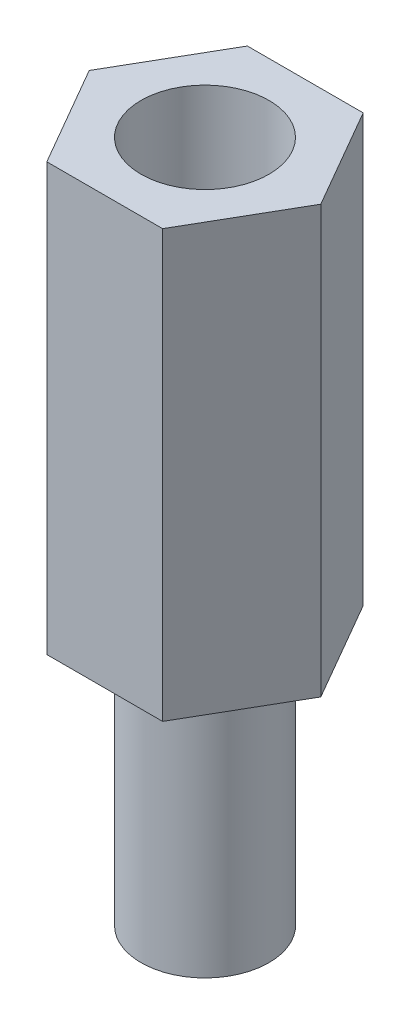
ISO-10303-21;
HEADER;
FILE_DESCRIPTION(('STEP AP214'),'2;1');
FILE_NAME('part.step','',(''),(''),'','','');
FILE_SCHEMA(('AUTOMOTIVE_DESIGN { 1 0 10303 214 1 1 1 1 }'));
ENDSEC;
DATA;
#1=APPLICATION_CONTEXT('core data for automotive mechanical design processes');
#2=APPLICATION_PROTOCOL_DEFINITION('international standard','automotive_design',2000,#1);
#3=PRODUCT_CONTEXT('',#1,'mechanical');
#4=PRODUCT('Part','Part','',(#3));
#5=PRODUCT_RELATED_PRODUCT_CATEGORY('part','',(#4));
#6=PRODUCT_DEFINITION_FORMATION('','',#4);
#7=PRODUCT_DEFINITION_CONTEXT('part definition',#1,'design');
#8=PRODUCT_DEFINITION('design','',#6,#7);
#9=PRODUCT_DEFINITION_SHAPE('','',#8);
#10=(LENGTH_UNIT() NAMED_UNIT(*) SI_UNIT(.MILLI.,.METRE.));
#11=(NAMED_UNIT(*) PLANE_ANGLE_UNIT() SI_UNIT($,.RADIAN.));
#12=(NAMED_UNIT(*) SI_UNIT($,.STERADIAN.) SOLID_ANGLE_UNIT());
#13=UNCERTAINTY_MEASURE_WITH_UNIT(LENGTH_MEASURE(1.E-05),#10,'distance_accuracy_value','');
#14=(GEOMETRIC_REPRESENTATION_CONTEXT(3) GLOBAL_UNCERTAINTY_ASSIGNED_CONTEXT((#13)) GLOBAL_UNIT_ASSIGNED_CONTEXT((#10,
#11,#12)) REPRESENTATION_CONTEXT('',''));
#15=CARTESIAN_POINT('',(0.,0.,0.));
#16=DIRECTION('',(0.,0.,1.));
#17=DIRECTION('',(1.,0.,0.));
#18=AXIS2_PLACEMENT_3D('',#15,#16,#17);
#19=CARTESIAN_POINT('',(0.,-6.,0.));
#20=DIRECTION('',(0.,1.,0.));
#21=DIRECTION('',(0.,0.,1.));
#22=AXIS2_PLACEMENT_3D('',#19,#20,#21);
#23=CYLINDRICAL_SURFACE('',#22,1.5);
#24=CARTESIAN_POINT('',(0.,-6.,0.));
#25=DIRECTION('',(0.,-1.,0.));
#26=DIRECTION('',(0.,0.,-1.));
#27=AXIS2_PLACEMENT_3D('',#24,#25,#26);
#28=CIRCLE('',#27,1.5);
#29=CARTESIAN_POINT('',(0.,-6.,-1.5));
#30=VERTEX_POINT('',#29);
#31=EDGE_CURVE('E11',#30,#30,#28,.T.);
#32=ORIENTED_EDGE('',*,*,#31,.F.);
#33=EDGE_LOOP('',(#32));
#34=FACE_BOUND('',#33,.T.);
#35=CARTESIAN_POINT('',(0.,0.,0.));
#36=DIRECTION('',(0.,-1.,0.));
#37=DIRECTION('',(0.,0.,-1.));
#38=AXIS2_PLACEMENT_3D('',#35,#36,#37);
#39=CIRCLE('',#38,1.5);
#40=CARTESIAN_POINT('',(0.,0.,-1.5));
#41=VERTEX_POINT('',#40);
#42=EDGE_CURVE('E45',#41,#41,#39,.T.);
#43=ORIENTED_EDGE('',*,*,#42,.T.);
#44=EDGE_LOOP('',(#43));
#45=FACE_BOUND('',#44,.T.);
#46=ADVANCED_FACE('F42',(#34,#45),#23,.T.);
#47=CARTESIAN_POINT('',(0.,-6.,0.));
#48=DIRECTION('',(0.,-1.,0.));
#49=DIRECTION('',(0.,0.,-1.));
#50=AXIS2_PLACEMENT_3D('',#47,#48,#49);
#51=PLANE('',#50);
#52=ORIENTED_EDGE('',*,*,#31,.T.);
#53=EDGE_LOOP('',(#52));
#54=FACE_BOUND('',#53,.T.);
#55=ADVANCED_FACE('F57',(#54),#51,.T.);
#56=CARTESIAN_POINT('',(0.,0.,0.));
#57=DIRECTION('',(0.,-1.,0.));
#58=DIRECTION('',(0.,0.,-1.));
#59=AXIS2_PLACEMENT_3D('',#56,#57,#58);
#60=PLANE('',#59);
#61=ORIENTED_EDGE('',*,*,#42,.F.);
#62=EDGE_LOOP('',(#61));
#63=FACE_BOUND('',#62,.T.);
#64=ADVANCED_FACE('F55',(#63),#60,.F.);
#65=CLOSED_SHELL('',(#46,#55,#64));
#66=MANIFOLD_SOLID_BREP('B2',#65);
#67=CARTESIAN_POINT('',(0.,10.,0.));
#68=DIRECTION('',(0.,1.,0.));
#69=DIRECTION('',(0.,0.,1.));
#70=AXIS2_PLACEMENT_3D('',#67,#68,#69);
#71=PLANE('',#70);
#72=DIRECTION('',(0.5,0.,-0.866025403784438));
#73=VECTOR('',#72,1.);
#74=CARTESIAN_POINT('',(1.35677313259562,10.,2.35));
#75=LINE('',#74,#73);
#76=CARTESIAN_POINT('',(1.35677313259562,10.,2.35));
#77=VERTEX_POINT('',#76);
#78=CARTESIAN_POINT('',(2.71354626519124,10.,0.));
#79=VERTEX_POINT('',#78);
#80=EDGE_CURVE('E178',#77,#79,#75,.T.);
#81=ORIENTED_EDGE('',*,*,#80,.T.);
#82=DIRECTION('',(-0.5,0.,-0.866025403784438));
#83=VECTOR('',#82,1.);
#84=CARTESIAN_POINT('',(2.71354626519124,10.,0.));
#85=LINE('',#84,#83);
#86=CARTESIAN_POINT('',(1.35677313259562,10.,-2.35));
#87=VERTEX_POINT('',#86);
#88=EDGE_CURVE('E136',#79,#87,#85,.T.);
#89=ORIENTED_EDGE('',*,*,#88,.T.);
#90=DIRECTION('',(-1.,0.,0.));
#91=VECTOR('',#90,1.);
#92=CARTESIAN_POINT('',(1.35677313259562,10.,-2.35));
#93=LINE('',#92,#91);
#94=CARTESIAN_POINT('',(-1.35677313259562,10.,-2.35));
#95=VERTEX_POINT('',#94);
#96=EDGE_CURVE('E149',#87,#95,#93,.T.);
#97=ORIENTED_EDGE('',*,*,#96,.T.);
#98=DIRECTION('',(-0.5,0.,0.866025403784439));
#99=VECTOR('',#98,1.);
#100=CARTESIAN_POINT('',(-1.35677313259562,10.,-2.35));
#101=LINE('',#100,#99);
#102=CARTESIAN_POINT('',(-2.71354626519124,10.,0.));
#103=VERTEX_POINT('',#102);
#104=EDGE_CURVE('E143',#95,#103,#101,.T.);
#105=ORIENTED_EDGE('',*,*,#104,.T.);
#106=DIRECTION('',(0.5,0.,0.866025403784438));
#107=VECTOR('',#106,1.);
#108=CARTESIAN_POINT('',(-2.71354626519124,10.,0.));
#109=LINE('',#108,#107);
#110=CARTESIAN_POINT('',(-1.35677313259562,10.,2.35));
#111=VERTEX_POINT('',#110);
#112=EDGE_CURVE('E147',#103,#111,#109,.T.);
#113=ORIENTED_EDGE('',*,*,#112,.T.);
#114=DIRECTION('',(1.,0.,0.));
#115=VECTOR('',#114,1.);
#116=CARTESIAN_POINT('',(-1.35677313259562,10.,2.35));
#117=LINE('',#116,#115);
#118=EDGE_CURVE('E99',#111,#77,#117,.T.);
#119=ORIENTED_EDGE('',*,*,#118,.T.);
#120=EDGE_LOOP('',(#81,#89,#97,#105,#113,#119));
#121=FACE_BOUND('',#120,.T.);
#122=CARTESIAN_POINT('',(0.,10.,0.));
#123=DIRECTION('',(0.,1.,0.));
#124=DIRECTION('',(0.,0.,1.));
#125=AXIS2_PLACEMENT_3D('',#122,#123,#124);
#126=CIRCLE('',#125,1.5);
#127=CARTESIAN_POINT('',(0.,10.,1.5));
#128=VERTEX_POINT('',#127);
#129=EDGE_CURVE('E171',#128,#128,#126,.T.);
#130=ORIENTED_EDGE('',*,*,#129,.F.);
#131=EDGE_LOOP('',(#130));
#132=FACE_BOUND('',#131,.T.);
#133=ADVANCED_FACE('F82',(#121,#132),#71,.T.);
#134=CARTESIAN_POINT('',(0.,0.,0.));
#135=DIRECTION('',(0.,1.,0.));
#136=DIRECTION('',(0.,0.,1.));
#137=AXIS2_PLACEMENT_3D('',#134,#135,#136);
#138=PLANE('',#137);
#139=DIRECTION('',(0.5,0.,-0.866025403784438));
#140=VECTOR('',#139,1.);
#141=CARTESIAN_POINT('',(1.35677313259562,0.,2.35));
#142=LINE('',#141,#140);
#143=CARTESIAN_POINT('',(1.35677313259562,0.,2.35));
#144=VERTEX_POINT('',#143);
#145=CARTESIAN_POINT('',(2.71354626519124,0.,0.));
#146=VERTEX_POINT('',#145);
#147=EDGE_CURVE('E167',#144,#146,#142,.T.);
#148=ORIENTED_EDGE('',*,*,#147,.F.);
#149=DIRECTION('',(1.,0.,0.));
#150=VECTOR('',#149,1.);
#151=CARTESIAN_POINT('',(-1.35677313259562,0.,2.35));
#152=LINE('',#151,#150);
#153=CARTESIAN_POINT('',(-1.35677313259562,0.,2.35));
#154=VERTEX_POINT('',#153);
#155=EDGE_CURVE('E128',#154,#144,#152,.T.);
#156=ORIENTED_EDGE('',*,*,#155,.F.);
#157=DIRECTION('',(0.5,0.,0.866025403784438));
#158=VECTOR('',#157,1.);
#159=CARTESIAN_POINT('',(-2.71354626519124,0.,0.));
#160=LINE('',#159,#158);
#161=CARTESIAN_POINT('',(-2.71354626519124,0.,0.));
#162=VERTEX_POINT('',#161);
#163=EDGE_CURVE('E122',#162,#154,#160,.T.);
#164=ORIENTED_EDGE('',*,*,#163,.F.);
#165=DIRECTION('',(-0.5,0.,0.866025403784439));
#166=VECTOR('',#165,1.);
#167=CARTESIAN_POINT('',(-1.35677313259562,0.,-2.35));
#168=LINE('',#167,#166);
#169=CARTESIAN_POINT('',(-1.35677313259562,0.,-2.35));
#170=VERTEX_POINT('',#169);
#171=EDGE_CURVE('E157',#170,#162,#168,.T.);
#172=ORIENTED_EDGE('',*,*,#171,.F.);
#173=DIRECTION('',(-1.,0.,0.));
#174=VECTOR('',#173,1.);
#175=CARTESIAN_POINT('',(1.35677313259562,0.,-2.35));
#176=LINE('',#175,#174);
#177=CARTESIAN_POINT('',(1.35677313259562,0.,-2.35));
#178=VERTEX_POINT('',#177);
#179=EDGE_CURVE('E173',#178,#170,#176,.T.);
#180=ORIENTED_EDGE('',*,*,#179,.F.);
#181=DIRECTION('',(-0.5,0.,-0.866025403784438));
#182=VECTOR('',#181,1.);
#183=CARTESIAN_POINT('',(2.71354626519124,0.,0.));
#184=LINE('',#183,#182);
#185=EDGE_CURVE('E170',#146,#178,#184,.T.);
#186=ORIENTED_EDGE('',*,*,#185,.F.);
#187=EDGE_LOOP('',(#148,#156,#164,#172,#180,#186));
#188=FACE_BOUND('',#187,.T.);
#189=CARTESIAN_POINT('',(0.,0.,0.));
#190=DIRECTION('',(0.,1.,0.));
#191=DIRECTION('',(0.,0.,1.));
#192=AXIS2_PLACEMENT_3D('',#189,#190,#191);
#193=CIRCLE('',#192,1.5);
#194=CARTESIAN_POINT('',(0.,0.,1.5));
#195=VERTEX_POINT('',#194);
#196=EDGE_CURVE('E271',#195,#195,#193,.T.);
#197=ORIENTED_EDGE('',*,*,#196,.T.);
#198=EDGE_LOOP('',(#197));
#199=FACE_BOUND('',#198,.T.);
#200=ADVANCED_FACE('F187',(#188,#199),#138,.F.);
#201=CARTESIAN_POINT('',(1.35677313259562,10.,2.35));
#202=DIRECTION('',(-0.866025403784439,0.,-0.5));
#203=DIRECTION('',(-0.5,0.,0.866025403784439));
#204=AXIS2_PLACEMENT_3D('',#201,#202,#203);
#205=PLANE('',#204);
#206=ORIENTED_EDGE('',*,*,#147,.T.);
#207=DIRECTION('',(0.,-1.,0.));
#208=VECTOR('',#207,1.);
#209=CARTESIAN_POINT('',(2.71354626519124,10.,0.));
#210=LINE('',#209,#208);
#211=EDGE_CURVE('E40',#79,#146,#210,.T.);
#212=ORIENTED_EDGE('',*,*,#211,.F.);
#213=ORIENTED_EDGE('',*,*,#80,.F.);
#214=DIRECTION('',(0.,-1.,0.));
#215=VECTOR('',#214,1.);
#216=CARTESIAN_POINT('',(1.35677313259562,10.,2.35));
#217=LINE('',#216,#215);
#218=EDGE_CURVE('E163',#77,#144,#217,.T.);
#219=ORIENTED_EDGE('',*,*,#218,.T.);
#220=EDGE_LOOP('',(#206,#212,#213,#219));
#221=FACE_BOUND('',#220,.T.);
#222=ADVANCED_FACE('F84',(#221),#205,.F.);
#223=CARTESIAN_POINT('',(2.71354626519124,10.,0.));
#224=DIRECTION('',(-0.866025403784438,0.,0.5));
#225=DIRECTION('',(0.5,0.,0.866025403784438));
#226=AXIS2_PLACEMENT_3D('',#223,#224,#225);
#227=PLANE('',#226);
#228=ORIENTED_EDGE('',*,*,#185,.T.);
#229=DIRECTION('',(0.,-1.,0.));
#230=VECTOR('',#229,1.);
#231=CARTESIAN_POINT('',(1.35677313259562,10.,-2.35));
#232=LINE('',#231,#230);
#233=EDGE_CURVE('E91',#87,#178,#232,.T.);
#234=ORIENTED_EDGE('',*,*,#233,.F.);
#235=ORIENTED_EDGE('',*,*,#88,.F.);
#236=ORIENTED_EDGE('',*,*,#211,.T.);
#237=EDGE_LOOP('',(#228,#234,#235,#236));
#238=FACE_BOUND('',#237,.T.);
#239=ADVANCED_FACE('F212',(#238),#227,.F.);
#240=CARTESIAN_POINT('',(1.35677313259562,10.,-2.35));
#241=DIRECTION('',(0.,0.,1.));
#242=DIRECTION('',(1.,0.,0.));
#243=AXIS2_PLACEMENT_3D('',#240,#241,#242);
#244=PLANE('',#243);
#245=ORIENTED_EDGE('',*,*,#179,.T.);
#246=DIRECTION('',(0.,-1.,0.));
#247=VECTOR('',#246,1.);
#248=CARTESIAN_POINT('',(-1.35677313259562,10.,-2.35));
#249=LINE('',#248,#247);
#250=EDGE_CURVE('E158',#95,#170,#249,.T.);
#251=ORIENTED_EDGE('',*,*,#250,.F.);
#252=ORIENTED_EDGE('',*,*,#96,.F.);
#253=ORIENTED_EDGE('',*,*,#233,.T.);
#254=EDGE_LOOP('',(#245,#251,#252,#253));
#255=FACE_BOUND('',#254,.T.);
#256=ADVANCED_FACE('F184',(#255),#244,.F.);
#257=CARTESIAN_POINT('',(-1.35677313259562,10.,-2.35));
#258=DIRECTION('',(0.866025403784439,0.,0.5));
#259=DIRECTION('',(0.5,0.,-0.866025403784439));
#260=AXIS2_PLACEMENT_3D('',#257,#258,#259);
#261=PLANE('',#260);
#262=ORIENTED_EDGE('',*,*,#171,.T.);
#263=DIRECTION('',(0.,-1.,0.));
#264=VECTOR('',#263,1.);
#265=CARTESIAN_POINT('',(-2.71354626519124,10.,0.));
#266=LINE('',#265,#264);
#267=EDGE_CURVE('E154',#103,#162,#266,.T.);
#268=ORIENTED_EDGE('',*,*,#267,.F.);
#269=ORIENTED_EDGE('',*,*,#104,.F.);
#270=ORIENTED_EDGE('',*,*,#250,.T.);
#271=EDGE_LOOP('',(#262,#268,#269,#270));
#272=FACE_BOUND('',#271,.T.);
#273=ADVANCED_FACE('F155',(#272),#261,.F.);
#274=CARTESIAN_POINT('',(-2.71354626519124,10.,0.));
#275=DIRECTION('',(0.866025403784439,0.,-0.5));
#276=DIRECTION('',(-0.5,0.,-0.866025403784439));
#277=AXIS2_PLACEMENT_3D('',#274,#275,#276);
#278=PLANE('',#277);
#279=ORIENTED_EDGE('',*,*,#163,.T.);
#280=DIRECTION('',(0.,-1.,0.));
#281=VECTOR('',#280,1.);
#282=CARTESIAN_POINT('',(-1.35677313259562,10.,2.35));
#283=LINE('',#282,#281);
#284=EDGE_CURVE('E159',#111,#154,#283,.T.);
#285=ORIENTED_EDGE('',*,*,#284,.F.);
#286=ORIENTED_EDGE('',*,*,#112,.F.);
#287=ORIENTED_EDGE('',*,*,#267,.T.);
#288=EDGE_LOOP('',(#279,#285,#286,#287));
#289=FACE_BOUND('',#288,.T.);
#290=ADVANCED_FACE('F161',(#289),#278,.F.);
#291=CARTESIAN_POINT('',(-1.35677313259562,10.,2.35));
#292=DIRECTION('',(0.,0.,-1.));
#293=DIRECTION('',(-1.,0.,0.));
#294=AXIS2_PLACEMENT_3D('',#291,#292,#293);
#295=PLANE('',#294);
#296=ORIENTED_EDGE('',*,*,#155,.T.);
#297=ORIENTED_EDGE('',*,*,#218,.F.);
#298=ORIENTED_EDGE('',*,*,#118,.F.);
#299=ORIENTED_EDGE('',*,*,#284,.T.);
#300=EDGE_LOOP('',(#296,#297,#298,#299));
#301=FACE_BOUND('',#300,.T.);
#302=ADVANCED_FACE('F192',(#301),#295,.F.);
#303=CARTESIAN_POINT('',(0.,10.,0.));
#304=DIRECTION('',(0.,-1.,0.));
#305=DIRECTION('',(0.,0.,-1.));
#306=AXIS2_PLACEMENT_3D('',#303,#304,#305);
#307=CYLINDRICAL_SURFACE('',#306,1.5);
#308=ORIENTED_EDGE('',*,*,#129,.T.);
#309=EDGE_LOOP('',(#308));
#310=FACE_BOUND('',#309,.T.);
#311=ORIENTED_EDGE('',*,*,#196,.F.);
#312=EDGE_LOOP('',(#311));
#313=FACE_BOUND('',#312,.T.);
#314=ADVANCED_FACE('F194',(#310,#313),#307,.F.);
#315=CLOSED_SHELL('',(#133,#200,#222,#239,#256,#273,#290,#302,#314));
#316=MANIFOLD_SOLID_BREP('B6',#315);
#317=ADVANCED_BREP_SHAPE_REPRESENTATION('',(#18,#66,#316),#14);
#318=SHAPE_DEFINITION_REPRESENTATION(#9,#317);
ENDSEC;
END-ISO-10303-21;
